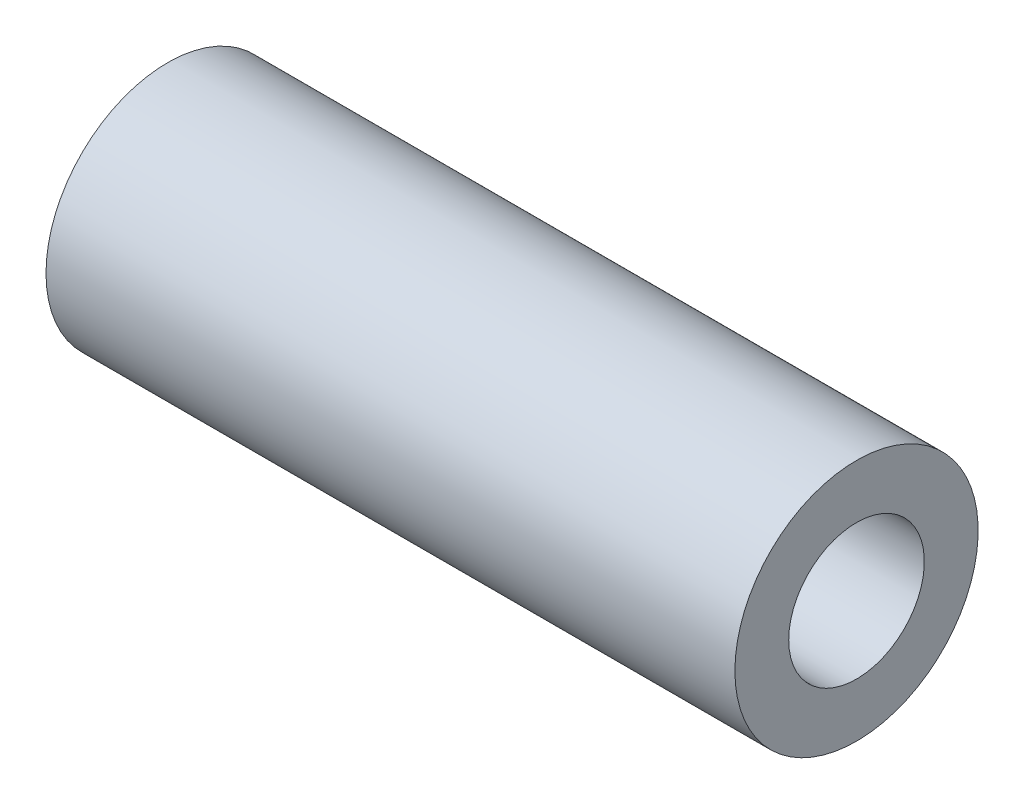
ISO-10303-21;
HEADER;
FILE_DESCRIPTION(('STEP AP214'),'2;1');
FILE_NAME('part.step','',(''),(''),'','','');
FILE_SCHEMA(('AUTOMOTIVE_DESIGN { 1 0 10303 214 1 1 1 1 }'));
ENDSEC;
DATA;
#1=APPLICATION_CONTEXT('core data for automotive mechanical design processes');
#2=APPLICATION_PROTOCOL_DEFINITION('international standard','automotive_design',2000,#1);
#3=PRODUCT_CONTEXT('',#1,'mechanical');
#4=PRODUCT('Part','Part','',(#3));
#5=PRODUCT_RELATED_PRODUCT_CATEGORY('part','',(#4));
#6=PRODUCT_DEFINITION_FORMATION('','',#4);
#7=PRODUCT_DEFINITION_CONTEXT('part definition',#1,'design');
#8=PRODUCT_DEFINITION('design','',#6,#7);
#9=PRODUCT_DEFINITION_SHAPE('','',#8);
#10=(LENGTH_UNIT() NAMED_UNIT(*) SI_UNIT(.MILLI.,.METRE.));
#11=(NAMED_UNIT(*) PLANE_ANGLE_UNIT() SI_UNIT($,.RADIAN.));
#12=(NAMED_UNIT(*) SI_UNIT($,.STERADIAN.) SOLID_ANGLE_UNIT());
#13=UNCERTAINTY_MEASURE_WITH_UNIT(LENGTH_MEASURE(1.E-05),#10,'distance_accuracy_value','');
#14=(GEOMETRIC_REPRESENTATION_CONTEXT(3) GLOBAL_UNCERTAINTY_ASSIGNED_CONTEXT((#13)) GLOBAL_UNIT_ASSIGNED_CONTEXT((#10,
#11,#12)) REPRESENTATION_CONTEXT('',''));
#15=CARTESIAN_POINT('',(0.,0.,0.));
#16=DIRECTION('',(0.,0.,1.));
#17=DIRECTION('',(1.,0.,0.));
#18=AXIS2_PLACEMENT_3D('',#15,#16,#17);
#19=CARTESIAN_POINT('',(0.,0.,0.));
#20=DIRECTION('',(-1.,0.,0.));
#21=DIRECTION('',(0.,0.,1.));
#22=AXIS2_PLACEMENT_3D('',#19,#20,#21);
#23=PLANE('',#22);
#24=CARTESIAN_POINT('',(0.,0.,0.));
#25=DIRECTION('',(-1.,0.,0.));
#26=DIRECTION('',(0.,0.,1.));
#27=AXIS2_PLACEMENT_3D('',#24,#25,#26);
#28=CIRCLE('',#27,5.);
#29=CARTESIAN_POINT('',(0.,0.,5.));
#30=VERTEX_POINT('',#29);
#31=EDGE_CURVE('E66',#30,#30,#28,.F.);
#32=ORIENTED_EDGE('',*,*,#31,.F.);
#33=EDGE_LOOP('',(#32));
#34=FACE_BOUND('',#33,.T.);
#35=CARTESIAN_POINT('',(0.,0.,0.));
#36=DIRECTION('',(-1.,0.,0.));
#37=DIRECTION('',(0.,0.,1.));
#38=AXIS2_PLACEMENT_3D('',#35,#36,#37);
#39=CIRCLE('',#38,8.96875);
#40=CARTESIAN_POINT('',(0.,0.,8.96875));
#41=VERTEX_POINT('',#40);
#42=EDGE_CURVE('E56',#41,#41,#39,.T.);
#43=ORIENTED_EDGE('',*,*,#42,.F.);
#44=EDGE_LOOP('',(#43));
#45=FACE_BOUND('',#44,.T.);
#46=ADVANCED_FACE('F49',(#34,#45),#23,.F.);
#47=CARTESIAN_POINT('',(-50.8,0.,0.));
#48=DIRECTION('',(-1.,0.,0.));
#49=DIRECTION('',(0.,0.,1.));
#50=AXIS2_PLACEMENT_3D('',#47,#48,#49);
#51=PLANE('',#50);
#52=CARTESIAN_POINT('',(-50.8,0.,0.));
#53=DIRECTION('',(-1.,0.,0.));
#54=DIRECTION('',(0.,0.,1.));
#55=AXIS2_PLACEMENT_3D('',#52,#53,#54);
#56=CIRCLE('',#55,5.);
#57=CARTESIAN_POINT('',(-50.8,0.,5.00000000000001));
#58=VERTEX_POINT('',#57);
#59=EDGE_CURVE('E61',#58,#58,#56,.F.);
#60=ORIENTED_EDGE('',*,*,#59,.T.);
#61=EDGE_LOOP('',(#60));
#62=FACE_BOUND('',#61,.T.);
#63=CARTESIAN_POINT('',(-50.8,0.,0.));
#64=DIRECTION('',(-1.,0.,0.));
#65=DIRECTION('',(0.,0.,1.));
#66=AXIS2_PLACEMENT_3D('',#63,#64,#65);
#67=CIRCLE('',#66,8.96875);
#68=CARTESIAN_POINT('',(-50.8,0.,8.96875000000001));
#69=VERTEX_POINT('',#68);
#70=EDGE_CURVE('E11',#69,#69,#67,.T.);
#71=ORIENTED_EDGE('',*,*,#70,.T.);
#72=EDGE_LOOP('',(#71));
#73=FACE_BOUND('',#72,.T.);
#74=ADVANCED_FACE('F78',(#62,#73),#51,.T.);
#75=CARTESIAN_POINT('',(0.,0.,0.));
#76=DIRECTION('',(-1.,0.,0.));
#77=DIRECTION('',(0.,0.,1.));
#78=AXIS2_PLACEMENT_3D('',#75,#76,#77);
#79=CYLINDRICAL_SURFACE('',#78,8.96875);
#80=ORIENTED_EDGE('',*,*,#70,.F.);
#81=EDGE_LOOP('',(#80));
#82=FACE_BOUND('',#81,.T.);
#83=ORIENTED_EDGE('',*,*,#42,.T.);
#84=EDGE_LOOP('',(#83));
#85=FACE_BOUND('',#84,.T.);
#86=ADVANCED_FACE('F82',(#82,#85),#79,.T.);
#87=CARTESIAN_POINT('',(4.,0.,0.));
#88=DIRECTION('',(-1.,0.,0.));
#89=DIRECTION('',(0.,0.,1.));
#90=AXIS2_PLACEMENT_3D('',#87,#88,#89);
#91=CYLINDRICAL_SURFACE('',#90,5.);
#92=ORIENTED_EDGE('',*,*,#31,.T.);
#93=EDGE_LOOP('',(#92));
#94=FACE_BOUND('',#93,.T.);
#95=ORIENTED_EDGE('',*,*,#59,.F.);
#96=EDGE_LOOP('',(#95));
#97=FACE_BOUND('',#96,.T.);
#98=ADVANCED_FACE('F73',(#94,#97),#91,.F.);
#99=CLOSED_SHELL('',(#46,#74,#86,#98));
#100=MANIFOLD_SOLID_BREP('B2',#99);
#101=ADVANCED_BREP_SHAPE_REPRESENTATION('',(#18,#100),#14);
#102=SHAPE_DEFINITION_REPRESENTATION(#9,#101);
ENDSEC;
END-ISO-10303-21;
